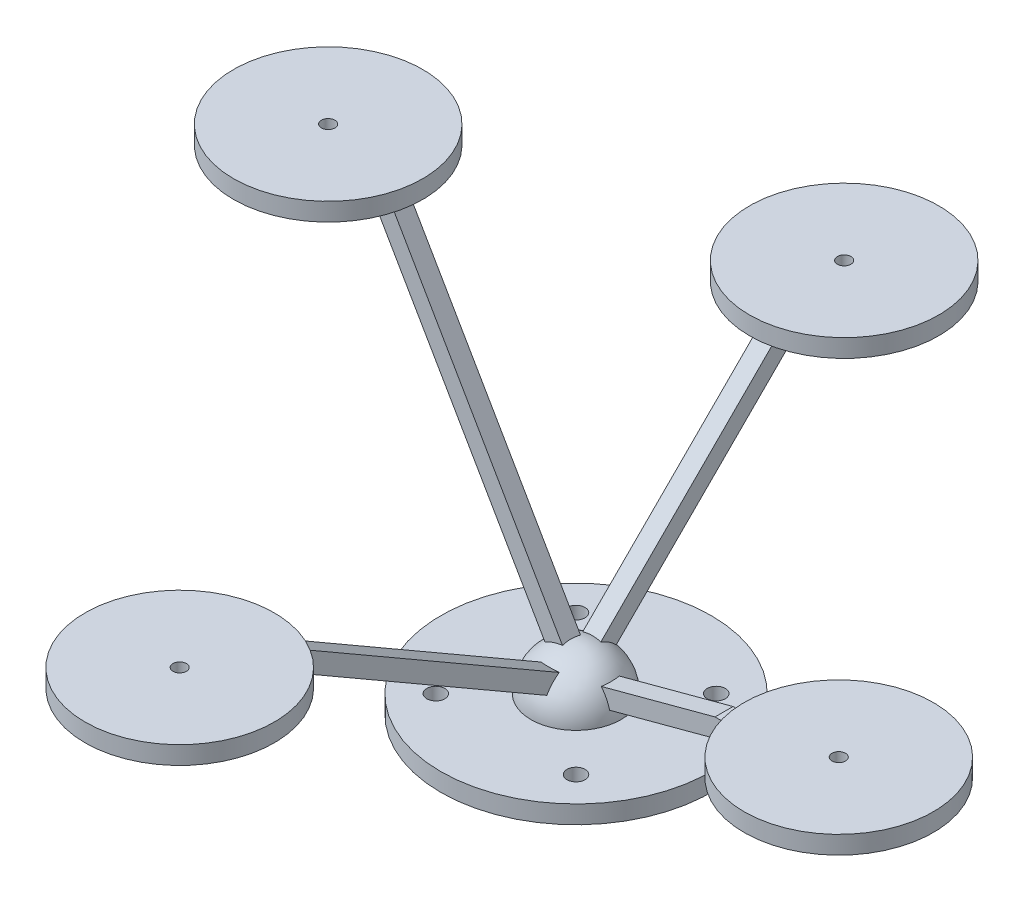
ISO-10303-21;
HEADER;
FILE_DESCRIPTION(('STEP AP214'),'2;1');
FILE_NAME('part.step','',(''),(''),'','','');
FILE_SCHEMA(('AUTOMOTIVE_DESIGN { 1 0 10303 214 1 1 1 1 }'));
ENDSEC;
DATA;
#1=APPLICATION_CONTEXT('core data for automotive mechanical design processes');
#2=APPLICATION_PROTOCOL_DEFINITION('international standard','automotive_design',2000,#1);
#3=PRODUCT_CONTEXT('',#1,'mechanical');
#4=PRODUCT('Part','Part','',(#3));
#5=PRODUCT_RELATED_PRODUCT_CATEGORY('part','',(#4));
#6=PRODUCT_DEFINITION_FORMATION('','',#4);
#7=PRODUCT_DEFINITION_CONTEXT('part definition',#1,'design');
#8=PRODUCT_DEFINITION('design','',#6,#7);
#9=PRODUCT_DEFINITION_SHAPE('','',#8);
#10=(LENGTH_UNIT() NAMED_UNIT(*) SI_UNIT(.MILLI.,.METRE.));
#11=(NAMED_UNIT(*) PLANE_ANGLE_UNIT() SI_UNIT($,.RADIAN.));
#12=(NAMED_UNIT(*) SI_UNIT($,.STERADIAN.) SOLID_ANGLE_UNIT());
#13=UNCERTAINTY_MEASURE_WITH_UNIT(LENGTH_MEASURE(1.E-05),#10,'distance_accuracy_value','');
#14=(GEOMETRIC_REPRESENTATION_CONTEXT(3) GLOBAL_UNCERTAINTY_ASSIGNED_CONTEXT((#13)) GLOBAL_UNIT_ASSIGNED_CONTEXT((#10,
#11,#12)) REPRESENTATION_CONTEXT('',''));
#15=CARTESIAN_POINT('',(0.,0.,0.));
#16=DIRECTION('',(0.,0.,1.));
#17=DIRECTION('',(1.,0.,0.));
#18=AXIS2_PLACEMENT_3D('',#15,#16,#17);
#19=CARTESIAN_POINT('',(0.,2.,0.));
#20=DIRECTION('',(0.,-1.,0.));
#21=DIRECTION('',(0.,0.,-1.));
#22=AXIS2_PLACEMENT_3D('',#19,#20,#21);
#23=SPHERICAL_SURFACE('',#22,5.);
#24=CARTESIAN_POINT('',(0.,2.,0.));
#25=DIRECTION('',(0.,1.,0.));
#26=DIRECTION('',(0.,0.,1.));
#27=AXIS2_PLACEMENT_3D('',#24,#25,#26);
#28=CIRCLE('',#27,5.);
#29=CARTESIAN_POINT('',(0.,2.,5.));
#30=VERTEX_POINT('',#29);
#31=EDGE_CURVE('E326',#30,#30,#28,.T.);
#32=ORIENTED_EDGE('',*,*,#31,.T.);
#33=EDGE_LOOP('',(#32));
#34=FACE_BOUND('',#33,.T.);
#35=CARTESIAN_POINT('',(1.73205080756889,3.,0.));
#36=DIRECTION('',(-0.86602540378444,-0.499999999999999,0.));
#37=DIRECTION('',(0.499999999999998,-0.866025403784439,0.));
#38=AXIS2_PLACEMENT_3D('',#35,#36,#37);
#39=CIRCLE('',#38,4.58257569495584);
#40=CARTESIAN_POINT('',(-0.504017169930898,6.87298334620742,-1.));
#41=VERTEX_POINT('',#40);
#42=CARTESIAN_POINT('',(-0.504017169930893,6.87298334620742,1.));
#43=VERTEX_POINT('',#42);
#44=EDGE_CURVE('E337',#41,#43,#39,.F.);
#45=ORIENTED_EDGE('',*,*,#44,.T.);
#46=CARTESIAN_POINT('',(0.,2.,1.));
#47=DIRECTION('',(0.,0.,-1.));
#48=DIRECTION('',(-1.,0.,0.));
#49=AXIS2_PLACEMENT_3D('',#46,#47,#48);
#50=CIRCLE('',#49,4.89897948556636);
#51=CARTESIAN_POINT('',(-2.44948974278317,6.24264068711929,1.));
#52=VERTEX_POINT('',#51);
#53=EDGE_CURVE('E344',#43,#52,#50,.F.);
#54=ORIENTED_EDGE('',*,*,#53,.T.);
#55=CARTESIAN_POINT('',(0.,2.,0.));
#56=DIRECTION('',(0.86602540378444,0.499999999999998,0.));
#57=DIRECTION('',(-0.499999999999998,0.86602540378444,0.));
#58=AXIS2_PLACEMENT_3D('',#55,#56,#57);
#59=CIRCLE('',#58,5.);
#60=CARTESIAN_POINT('',(-2.44948974278317,6.24264068711929,-1.));
#61=VERTEX_POINT('',#60);
#62=EDGE_CURVE('E341',#52,#61,#59,.F.);
#63=ORIENTED_EDGE('',*,*,#62,.T.);
#64=CARTESIAN_POINT('',(0.,2.,-1.));
#65=DIRECTION('',(0.,0.,-1.));
#66=DIRECTION('',(-1.,0.,0.));
#67=AXIS2_PLACEMENT_3D('',#64,#65,#66);
#68=CIRCLE('',#67,4.89897948556636);
#69=EDGE_CURVE('E333',#41,#61,#68,.F.);
#70=ORIENTED_EDGE('',*,*,#69,.F.);
#71=EDGE_LOOP('',(#45,#54,#63,#70));
#72=FACE_BOUND('',#71,.T.);
#73=CARTESIAN_POINT('',(0.,2.,0.));
#74=DIRECTION('',(-0.258819045102514,0.96592582628907,0.));
#75=DIRECTION('',(-0.96592582628907,-0.258819045102514,0.));
#76=AXIS2_PLACEMENT_3D('',#73,#74,#75);
#77=CIRCLE('',#76,5.);
#78=CARTESIAN_POINT('',(4.73205080756889,3.26794919243109,-1.));
#79=VERTEX_POINT('',#78);
#80=CARTESIAN_POINT('',(4.73205080756889,3.26794919243109,1.));
#81=VERTEX_POINT('',#80);
#82=EDGE_CURVE('E351',#79,#81,#77,.F.);
#83=ORIENTED_EDGE('',*,*,#82,.T.);
#84=CARTESIAN_POINT('',(3.802113527405,5.08932561001975,1.));
#85=VERTEX_POINT('',#84);
#86=EDGE_CURVE('E347',#81,#85,#50,.F.);
#87=ORIENTED_EDGE('',*,*,#86,.T.);
#88=CARTESIAN_POINT('',(-0.517638090205028,3.93185165257814,0.));
#89=DIRECTION('',(0.258819045102515,-0.96592582628907,0.));
#90=DIRECTION('',(0.96592582628907,0.258819045102515,0.));
#91=AXIS2_PLACEMENT_3D('',#88,#89,#90);
#92=CIRCLE('',#91,4.58257569495584);
#93=CARTESIAN_POINT('',(3.802113527405,5.08932561001975,-1.));
#94=VERTEX_POINT('',#93);
#95=EDGE_CURVE('E348',#85,#94,#92,.F.);
#96=ORIENTED_EDGE('',*,*,#95,.T.);
#97=EDGE_CURVE('E338',#79,#94,#68,.F.);
#98=ORIENTED_EDGE('',*,*,#97,.F.);
#99=EDGE_LOOP('',(#83,#87,#96,#98));
#100=FACE_BOUND('',#99,.T.);
#101=CARTESIAN_POINT('',(0.,3.73205080756887,-1.));
#102=DIRECTION('',(0.,-0.866025403784438,0.500000000000001));
#103=DIRECTION('',(0.,-0.500000000000001,-0.866025403784438));
#104=AXIS2_PLACEMENT_3D('',#101,#102,#103);
#105=CIRCLE('',#104,4.58257569495584);
#106=CARTESIAN_POINT('',(-1.,5.96811878506867,2.87298334620742));
#107=VERTEX_POINT('',#106);
#108=CARTESIAN_POINT('',(1.,5.96811878506867,2.87298334620742));
#109=VERTEX_POINT('',#108);
#110=EDGE_CURVE('E177',#107,#109,#105,.F.);
#111=ORIENTED_EDGE('',*,*,#110,.T.);
#112=CARTESIAN_POINT('',(1.,2.,0.));
#113=DIRECTION('',(-1.,0.,0.));
#114=DIRECTION('',(0.,0.,1.));
#115=AXIS2_PLACEMENT_3D('',#112,#113,#114);
#116=CIRCLE('',#115,4.89897948556636);
#117=CARTESIAN_POINT('',(1.,4.44948974278318,4.24264068711928));
#118=VERTEX_POINT('',#117);
#119=EDGE_CURVE('E50',#109,#118,#116,.F.);
#120=ORIENTED_EDGE('',*,*,#119,.T.);
#121=CARTESIAN_POINT('',(0.,2.,0.));
#122=DIRECTION('',(0.,0.866025403784438,-0.500000000000001));
#123=DIRECTION('',(0.,0.500000000000001,0.866025403784438));
#124=AXIS2_PLACEMENT_3D('',#121,#122,#123);
#125=CIRCLE('',#124,5.);
#126=CARTESIAN_POINT('',(-1.,4.44948974278318,4.24264068711928));
#127=VERTEX_POINT('',#126);
#128=EDGE_CURVE('E360',#118,#127,#125,.F.);
#129=ORIENTED_EDGE('',*,*,#128,.T.);
#130=CARTESIAN_POINT('',(-1.,2.,0.));
#131=DIRECTION('',(-1.,0.,0.));
#132=DIRECTION('',(0.,0.,1.));
#133=AXIS2_PLACEMENT_3D('',#130,#131,#132);
#134=CIRCLE('',#133,4.89897948556636);
#135=EDGE_CURVE('E354',#107,#127,#134,.F.);
#136=ORIENTED_EDGE('',*,*,#135,.F.);
#137=EDGE_LOOP('',(#111,#120,#129,#136));
#138=FACE_BOUND('',#137,.T.);
#139=CARTESIAN_POINT('',(0.,2.,0.));
#140=DIRECTION('',(0.,0.707106781186551,0.707106781186544));
#141=DIRECTION('',(0.,-0.707106781186544,0.707106781186551));
#142=AXIS2_PLACEMENT_3D('',#139,#140,#141);
#143=CIRCLE('',#142,5.);
#144=CARTESIAN_POINT('',(-1.,5.46410161513774,-3.46410161513777));
#145=VERTEX_POINT('',#144);
#146=CARTESIAN_POINT('',(1.,5.46410161513774,-3.46410161513777));
#147=VERTEX_POINT('',#146);
#148=EDGE_CURVE('E43',#145,#147,#143,.F.);
#149=ORIENTED_EDGE('',*,*,#148,.T.);
#150=CARTESIAN_POINT('',(1.,6.57649122254147,-1.74806409779531));
#151=VERTEX_POINT('',#150);
#152=EDGE_CURVE('E11',#147,#151,#116,.F.);
#153=ORIENTED_EDGE('',*,*,#152,.T.);
#154=CARTESIAN_POINT('',(0.,3.4142135623731,1.41421356237309));
#155=DIRECTION('',(0.,-0.707106781186551,-0.707106781186544));
#156=DIRECTION('',(0.,0.707106781186544,-0.707106781186551));
#157=AXIS2_PLACEMENT_3D('',#154,#155,#156);
#158=CIRCLE('',#157,4.58257569495584);
#159=CARTESIAN_POINT('',(-1.,6.57649122254147,-1.74806409779531));
#160=VERTEX_POINT('',#159);
#161=EDGE_CURVE('E363',#151,#160,#158,.F.);
#162=ORIENTED_EDGE('',*,*,#161,.T.);
#163=EDGE_CURVE('E357',#145,#160,#134,.F.);
#164=ORIENTED_EDGE('',*,*,#163,.F.);
#165=EDGE_LOOP('',(#149,#153,#162,#164));
#166=FACE_BOUND('',#165,.T.);
#167=ADVANCED_FACE('F39',(#34,#72,#100,#138,#166),#23,.T.);
#168=CARTESIAN_POINT('',(0.,2.,0.));
#169=DIRECTION('',(0.,1.,0.));
#170=DIRECTION('',(0.,0.,1.));
#171=AXIS2_PLACEMENT_3D('',#168,#169,#170);
#172=PLANE('',#171);
#173=ORIENTED_EDGE('',*,*,#31,.F.);
#174=EDGE_LOOP('',(#173));
#175=FACE_BOUND('',#174,.T.);
#176=CARTESIAN_POINT('',(-7.77817459305207,2.,7.77817459305198));
#177=DIRECTION('',(0.,1.,0.));
#178=DIRECTION('',(0.,0.,1.));
#179=AXIS2_PLACEMENT_3D('',#176,#177,#178);
#180=CIRCLE('',#179,1.);
#181=CARTESIAN_POINT('',(-7.77817459305207,2.,8.77817459305198));
#182=VERTEX_POINT('',#181);
#183=EDGE_CURVE('E298',#182,#182,#180,.T.);
#184=ORIENTED_EDGE('',*,*,#183,.F.);
#185=EDGE_LOOP('',(#184));
#186=FACE_BOUND('',#185,.T.);
#187=CARTESIAN_POINT('',(7.77817459305206,2.,-7.77817459305199));
#188=DIRECTION('',(0.,1.,0.));
#189=DIRECTION('',(0.,0.,1.));
#190=AXIS2_PLACEMENT_3D('',#187,#188,#189);
#191=CIRCLE('',#190,1.);
#192=CARTESIAN_POINT('',(7.77817459305206,2.,-6.77817459305198));
#193=VERTEX_POINT('',#192);
#194=EDGE_CURVE('E314',#193,#193,#191,.T.);
#195=ORIENTED_EDGE('',*,*,#194,.F.);
#196=EDGE_LOOP('',(#195));
#197=FACE_BOUND('',#196,.T.);
#198=CARTESIAN_POINT('',(0.,2.,0.));
#199=DIRECTION('',(0.,1.,0.));
#200=DIRECTION('',(0.,0.,1.));
#201=AXIS2_PLACEMENT_3D('',#198,#199,#200);
#202=CIRCLE('',#201,15.);
#203=CARTESIAN_POINT('',(0.,2.,15.));
#204=VERTEX_POINT('',#203);
#205=EDGE_CURVE('E322',#204,#204,#202,.T.);
#206=ORIENTED_EDGE('',*,*,#205,.T.);
#207=EDGE_LOOP('',(#206));
#208=FACE_BOUND('',#207,.T.);
#209=CARTESIAN_POINT('',(-7.77817459305204,2.,-7.77817459305201));
#210=DIRECTION('',(0.,1.,0.));
#211=DIRECTION('',(0.,0.,1.));
#212=AXIS2_PLACEMENT_3D('',#209,#210,#211);
#213=CIRCLE('',#212,0.999999999999995);
#214=CARTESIAN_POINT('',(-7.77817459305204,2.,-6.77817459305201));
#215=VERTEX_POINT('',#214);
#216=EDGE_CURVE('E306',#215,#215,#213,.T.);
#217=ORIENTED_EDGE('',*,*,#216,.F.);
#218=EDGE_LOOP('',(#217));
#219=FACE_BOUND('',#218,.T.);
#220=CARTESIAN_POINT('',(7.77817459305204,2.,7.77817459305201));
#221=DIRECTION('',(0.,1.,0.));
#222=DIRECTION('',(0.,0.,1.));
#223=AXIS2_PLACEMENT_3D('',#220,#221,#222);
#224=CIRCLE('',#223,1.);
#225=CARTESIAN_POINT('',(7.77817459305204,2.,8.77817459305201));
#226=VERTEX_POINT('',#225);
#227=EDGE_CURVE('E290',#226,#226,#224,.T.);
#228=ORIENTED_EDGE('',*,*,#227,.F.);
#229=EDGE_LOOP('',(#228));
#230=FACE_BOUND('',#229,.T.);
#231=ADVANCED_FACE('F460',(#175,#186,#197,#208,#219,#230),#172,.T.);
#232=CARTESIAN_POINT('',(0.,0.,0.));
#233=DIRECTION('',(0.,1.,0.));
#234=DIRECTION('',(0.,0.,1.));
#235=AXIS2_PLACEMENT_3D('',#232,#233,#234);
#236=PLANE('',#235);
#237=CARTESIAN_POINT('',(0.,0.,0.));
#238=DIRECTION('',(0.,1.,0.));
#239=DIRECTION('',(0.,0.,1.));
#240=AXIS2_PLACEMENT_3D('',#237,#238,#239);
#241=CIRCLE('',#240,15.);
#242=CARTESIAN_POINT('',(0.,0.,15.));
#243=VERTEX_POINT('',#242);
#244=EDGE_CURVE('E318',#243,#243,#241,.T.);
#245=ORIENTED_EDGE('',*,*,#244,.F.);
#246=EDGE_LOOP('',(#245));
#247=FACE_BOUND('',#246,.T.);
#248=CARTESIAN_POINT('',(7.77817459305206,0.,-7.77817459305199));
#249=DIRECTION('',(0.,1.,0.));
#250=DIRECTION('',(0.,0.,1.));
#251=AXIS2_PLACEMENT_3D('',#248,#249,#250);
#252=CIRCLE('',#251,1.);
#253=CARTESIAN_POINT('',(7.77817459305206,0.,-6.77817459305198));
#254=VERTEX_POINT('',#253);
#255=EDGE_CURVE('E310',#254,#254,#252,.T.);
#256=ORIENTED_EDGE('',*,*,#255,.T.);
#257=EDGE_LOOP('',(#256));
#258=FACE_BOUND('',#257,.T.);
#259=CARTESIAN_POINT('',(-7.77817459305204,0.,-7.77817459305201));
#260=DIRECTION('',(0.,1.,0.));
#261=DIRECTION('',(0.,0.,1.));
#262=AXIS2_PLACEMENT_3D('',#259,#260,#261);
#263=CIRCLE('',#262,0.999999999999995);
#264=CARTESIAN_POINT('',(-7.77817459305204,0.,-6.77817459305201));
#265=VERTEX_POINT('',#264);
#266=EDGE_CURVE('E302',#265,#265,#263,.T.);
#267=ORIENTED_EDGE('',*,*,#266,.T.);
#268=EDGE_LOOP('',(#267));
#269=FACE_BOUND('',#268,.T.);
#270=CARTESIAN_POINT('',(-7.77817459305207,0.,7.77817459305198));
#271=DIRECTION('',(0.,1.,0.));
#272=DIRECTION('',(0.,0.,1.));
#273=AXIS2_PLACEMENT_3D('',#270,#271,#272);
#274=CIRCLE('',#273,1.);
#275=CARTESIAN_POINT('',(-7.77817459305207,0.,8.77817459305198));
#276=VERTEX_POINT('',#275);
#277=EDGE_CURVE('E294',#276,#276,#274,.T.);
#278=ORIENTED_EDGE('',*,*,#277,.T.);
#279=EDGE_LOOP('',(#278));
#280=FACE_BOUND('',#279,.T.);
#281=CARTESIAN_POINT('',(7.77817459305204,0.,7.77817459305201));
#282=DIRECTION('',(0.,1.,0.));
#283=DIRECTION('',(0.,0.,1.));
#284=AXIS2_PLACEMENT_3D('',#281,#282,#283);
#285=CIRCLE('',#284,1.);
#286=CARTESIAN_POINT('',(7.77817459305204,0.,8.77817459305201));
#287=VERTEX_POINT('',#286);
#288=EDGE_CURVE('E289',#287,#287,#285,.T.);
#289=ORIENTED_EDGE('',*,*,#288,.T.);
#290=EDGE_LOOP('',(#289));
#291=FACE_BOUND('',#290,.T.);
#292=ADVANCED_FACE('F468',(#247,#258,#269,#280,#291),#236,.F.);
#293=CARTESIAN_POINT('',(0.,2.,0.));
#294=DIRECTION('',(0.,-1.,0.));
#295=DIRECTION('',(0.,0.,-1.));
#296=AXIS2_PLACEMENT_3D('',#293,#294,#295);
#297=CYLINDRICAL_SURFACE('',#296,15.);
#298=ORIENTED_EDGE('',*,*,#205,.F.);
#299=EDGE_LOOP('',(#298));
#300=FACE_BOUND('',#299,.T.);
#301=ORIENTED_EDGE('',*,*,#244,.T.);
#302=EDGE_LOOP('',(#301));
#303=FACE_BOUND('',#302,.T.);
#304=ADVANCED_FACE('F41',(#300,#303),#297,.T.);
#305=CARTESIAN_POINT('',(7.77817459305206,2.,-7.77817459305199));
#306=DIRECTION('',(0.,-1.,0.));
#307=DIRECTION('',(0.,0.,-1.));
#308=AXIS2_PLACEMENT_3D('',#305,#306,#307);
#309=CYLINDRICAL_SURFACE('',#308,1.);
#310=ORIENTED_EDGE('',*,*,#194,.T.);
#311=EDGE_LOOP('',(#310));
#312=FACE_BOUND('',#311,.T.);
#313=ORIENTED_EDGE('',*,*,#255,.F.);
#314=EDGE_LOOP('',(#313));
#315=FACE_BOUND('',#314,.T.);
#316=ADVANCED_FACE('F488',(#312,#315),#309,.F.);
#317=CARTESIAN_POINT('',(-7.77817459305204,2.,-7.77817459305201));
#318=DIRECTION('',(0.,-1.,0.));
#319=DIRECTION('',(0.,0.,-1.));
#320=AXIS2_PLACEMENT_3D('',#317,#318,#319);
#321=CYLINDRICAL_SURFACE('',#320,0.999999999999995);
#322=ORIENTED_EDGE('',*,*,#216,.T.);
#323=EDGE_LOOP('',(#322));
#324=FACE_BOUND('',#323,.T.);
#325=ORIENTED_EDGE('',*,*,#266,.F.);
#326=EDGE_LOOP('',(#325));
#327=FACE_BOUND('',#326,.T.);
#328=ADVANCED_FACE('F484',(#324,#327),#321,.F.);
#329=CARTESIAN_POINT('',(-7.77817459305207,2.,7.77817459305198));
#330=DIRECTION('',(0.,-1.,0.));
#331=DIRECTION('',(0.,0.,-1.));
#332=AXIS2_PLACEMENT_3D('',#329,#330,#331);
#333=CYLINDRICAL_SURFACE('',#332,1.);
#334=ORIENTED_EDGE('',*,*,#183,.T.);
#335=EDGE_LOOP('',(#334));
#336=FACE_BOUND('',#335,.T.);
#337=ORIENTED_EDGE('',*,*,#277,.F.);
#338=EDGE_LOOP('',(#337));
#339=FACE_BOUND('',#338,.T.);
#340=ADVANCED_FACE('F480',(#336,#339),#333,.F.);
#341=CARTESIAN_POINT('',(7.77817459305204,2.,7.77817459305201));
#342=DIRECTION('',(0.,-1.,0.));
#343=DIRECTION('',(0.,0.,-1.));
#344=AXIS2_PLACEMENT_3D('',#341,#342,#343);
#345=CYLINDRICAL_SURFACE('',#344,1.);
#346=ORIENTED_EDGE('',*,*,#227,.T.);
#347=EDGE_LOOP('',(#346));
#348=FACE_BOUND('',#347,.T.);
#349=ORIENTED_EDGE('',*,*,#288,.F.);
#350=EDGE_LOOP('',(#349));
#351=FACE_BOUND('',#350,.T.);
#352=ADVANCED_FACE('F476',(#348,#351),#345,.F.);
#353=CARTESIAN_POINT('',(0.,0.,1.));
#354=DIRECTION('',(0.,0.,-1.));
#355=DIRECTION('',(-1.,0.,0.));
#356=AXIS2_PLACEMENT_3D('',#353,#354,#355);
#357=PLANE('',#356);
#358=ORIENTED_EDGE('',*,*,#53,.F.);
#359=DIRECTION('',(-0.499999999999998,0.866025403784439,0.));
#360=VECTOR('',#359,1.);
#361=CARTESIAN_POINT('',(-20.1905989232414,40.9711431702998,1.));
#362=LINE('',#361,#360);
#363=CARTESIAN_POINT('',(-20.1905989232414,40.9711431702998,1.));
#364=VERTEX_POINT('',#363);
#365=EDGE_CURVE('E246',#43,#364,#362,.T.);
#366=ORIENTED_EDGE('',*,*,#365,.T.);
#367=DIRECTION('',(-1.,0.,0.));
#368=VECTOR('',#367,1.);
#369=CARTESIAN_POINT('',(-22.4999999999999,40.9711431702998,1.));
#370=LINE('',#369,#368);
#371=CARTESIAN_POINT('',(-22.4999999999999,40.9711431702998,1.));
#372=VERTEX_POINT('',#371);
#373=EDGE_CURVE('E249',#364,#372,#370,.T.);
#374=ORIENTED_EDGE('',*,*,#373,.T.);
#375=DIRECTION('',(0.499999999999998,-0.86602540378444,0.));
#376=VECTOR('',#375,1.);
#377=CARTESIAN_POINT('',(0.,2.,1.));
#378=LINE('',#377,#376);
#379=EDGE_CURVE('E230',#372,#52,#378,.T.);
#380=ORIENTED_EDGE('',*,*,#379,.T.);
#381=EDGE_LOOP('',(#358,#366,#374,#380));
#382=FACE_BOUND('',#381,.T.);
#383=ADVANCED_FACE('F479',(#382),#357,.F.);
#384=CARTESIAN_POINT('',(0.,0.,-1.));
#385=DIRECTION('',(0.,0.,-1.));
#386=DIRECTION('',(-1.,0.,0.));
#387=AXIS2_PLACEMENT_3D('',#384,#385,#386);
#388=PLANE('',#387);
#389=DIRECTION('',(-0.499999999999998,0.866025403784439,0.));
#390=VECTOR('',#389,1.);
#391=CARTESIAN_POINT('',(-20.1905989232414,40.9711431702998,-1.));
#392=LINE('',#391,#390);
#393=CARTESIAN_POINT('',(-20.1905989232414,40.9711431702998,-1.));
#394=VERTEX_POINT('',#393);
#395=EDGE_CURVE('E268',#41,#394,#392,.T.);
#396=ORIENTED_EDGE('',*,*,#395,.F.);
#397=ORIENTED_EDGE('',*,*,#69,.T.);
#398=DIRECTION('',(0.499999999999998,-0.86602540378444,0.));
#399=VECTOR('',#398,1.);
#400=CARTESIAN_POINT('',(0.,2.,-1.));
#401=LINE('',#400,#399);
#402=CARTESIAN_POINT('',(-22.4999999999999,40.9711431702998,-1.));
#403=VERTEX_POINT('',#402);
#404=EDGE_CURVE('E225',#403,#61,#401,.T.);
#405=ORIENTED_EDGE('',*,*,#404,.F.);
#406=DIRECTION('',(-1.,0.,0.));
#407=VECTOR('',#406,1.);
#408=CARTESIAN_POINT('',(-22.4999999999999,40.9711431702998,-1.));
#409=LINE('',#408,#407);
#410=EDGE_CURVE('E235',#394,#403,#409,.T.);
#411=ORIENTED_EDGE('',*,*,#410,.F.);
#412=EDGE_LOOP('',(#396,#397,#405,#411));
#413=FACE_BOUND('',#412,.T.);
#414=ADVANCED_FACE('F549',(#413),#388,.T.);
#415=CARTESIAN_POINT('',(-20.1905989232414,40.9711431702998,1.));
#416=DIRECTION('',(-0.86602540378444,-0.499999999999999,0.));
#417=DIRECTION('',(0.499999999999998,-0.866025403784439,0.));
#418=AXIS2_PLACEMENT_3D('',#415,#416,#417);
#419=PLANE('',#418);
#420=ORIENTED_EDGE('',*,*,#44,.F.);
#421=ORIENTED_EDGE('',*,*,#395,.T.);
#422=DIRECTION('',(0.,0.,-1.));
#423=VECTOR('',#422,1.);
#424=CARTESIAN_POINT('',(-20.1905989232414,40.9711431702998,1.));
#425=LINE('',#424,#423);
#426=EDGE_CURVE('E277',#364,#394,#425,.T.);
#427=ORIENTED_EDGE('',*,*,#426,.F.);
#428=ORIENTED_EDGE('',*,*,#365,.F.);
#429=EDGE_LOOP('',(#420,#421,#427,#428));
#430=FACE_BOUND('',#429,.T.);
#431=ADVANCED_FACE('F559',(#430),#419,.F.);
#432=CARTESIAN_POINT('',(0.,2.,1.));
#433=DIRECTION('',(0.86602540378444,0.499999999999998,0.));
#434=DIRECTION('',(-0.499999999999998,0.86602540378444,0.));
#435=AXIS2_PLACEMENT_3D('',#432,#433,#434);
#436=PLANE('',#435);
#437=ORIENTED_EDGE('',*,*,#62,.F.);
#438=ORIENTED_EDGE('',*,*,#379,.F.);
#439=DIRECTION('',(0.,0.,-1.));
#440=VECTOR('',#439,1.);
#441=CARTESIAN_POINT('',(-22.4999999999999,40.9711431702998,1.));
#442=LINE('',#441,#440);
#443=EDGE_CURVE('E252',#372,#403,#442,.T.);
#444=ORIENTED_EDGE('',*,*,#443,.T.);
#445=ORIENTED_EDGE('',*,*,#404,.T.);
#446=EDGE_LOOP('',(#437,#438,#444,#445));
#447=FACE_BOUND('',#446,.T.);
#448=ADVANCED_FACE('F474',(#447),#436,.F.);
#449=ORIENTED_EDGE('',*,*,#86,.F.);
#450=DIRECTION('',(0.96592582628907,0.258819045102514,0.));
#451=VECTOR('',#450,1.);
#452=CARTESIAN_POINT('',(0.,2.,1.));
#453=LINE('',#452,#451);
#454=CARTESIAN_POINT('',(24.1481456572267,8.47047612756286,1.));
#455=VERTEX_POINT('',#454);
#456=EDGE_CURVE('E234',#81,#455,#453,.T.);
#457=ORIENTED_EDGE('',*,*,#456,.T.);
#458=DIRECTION('',(-1.,0.,0.));
#459=VECTOR('',#458,1.);
#460=CARTESIAN_POINT('',(16.420739046914,8.47047612756286,1.));
#461=LINE('',#460,#459);
#462=CARTESIAN_POINT('',(18.6958731770433,8.47047612756286,1.));
#463=VERTEX_POINT('',#462);
#464=EDGE_CURVE('E239',#455,#463,#461,.T.);
#465=ORIENTED_EDGE('',*,*,#464,.T.);
#466=CARTESIAN_POINT('',(16.420739046914,8.47047612756286,1.));
#467=VERTEX_POINT('',#466);
#468=EDGE_CURVE('E238',#463,#467,#461,.T.);
#469=ORIENTED_EDGE('',*,*,#468,.T.);
#470=DIRECTION('',(-0.96592582628907,-0.258819045102515,0.));
#471=VECTOR('',#470,1.);
#472=CARTESIAN_POINT('',(0.,4.07055236082016,1.));
#473=LINE('',#472,#471);
#474=EDGE_CURVE('E242',#467,#85,#473,.T.);
#475=ORIENTED_EDGE('',*,*,#474,.T.);
#476=EDGE_LOOP('',(#449,#457,#465,#469,#475));
#477=FACE_BOUND('',#476,.T.);
#478=ADVANCED_FACE('F552',(#477),#357,.F.);
#479=DIRECTION('',(0.96592582628907,0.258819045102514,0.));
#480=VECTOR('',#479,1.);
#481=CARTESIAN_POINT('',(0.,2.,-1.));
#482=LINE('',#481,#480);
#483=CARTESIAN_POINT('',(24.1481456572267,8.47047612756286,-1.));
#484=VERTEX_POINT('',#483);
#485=EDGE_CURVE('E256',#79,#484,#482,.T.);
#486=ORIENTED_EDGE('',*,*,#485,.F.);
#487=ORIENTED_EDGE('',*,*,#97,.T.);
#488=DIRECTION('',(-0.96592582628907,-0.258819045102515,0.));
#489=VECTOR('',#488,1.);
#490=CARTESIAN_POINT('',(0.,4.07055236082016,-1.));
#491=LINE('',#490,#489);
#492=CARTESIAN_POINT('',(16.420739046914,8.47047612756286,-1.));
#493=VERTEX_POINT('',#492);
#494=EDGE_CURVE('E264',#493,#94,#491,.T.);
#495=ORIENTED_EDGE('',*,*,#494,.F.);
#496=DIRECTION('',(-1.,0.,0.));
#497=VECTOR('',#496,1.);
#498=CARTESIAN_POINT('',(16.420739046914,8.47047612756286,-1.));
#499=LINE('',#498,#497);
#500=CARTESIAN_POINT('',(18.6958731770433,8.47047612756285,-1.));
#501=VERTEX_POINT('',#500);
#502=EDGE_CURVE('E259',#501,#493,#499,.T.);
#503=ORIENTED_EDGE('',*,*,#502,.F.);
#504=EDGE_CURVE('E260',#484,#501,#499,.T.);
#505=ORIENTED_EDGE('',*,*,#504,.F.);
#506=EDGE_LOOP('',(#486,#487,#495,#503,#505));
#507=FACE_BOUND('',#506,.T.);
#508=ADVANCED_FACE('F562',(#507),#388,.T.);
#509=CARTESIAN_POINT('',(0.,2.,1.));
#510=DIRECTION('',(-0.258819045102514,0.96592582628907,0.));
#511=DIRECTION('',(-0.96592582628907,-0.258819045102514,0.));
#512=AXIS2_PLACEMENT_3D('',#509,#510,#511);
#513=PLANE('',#512);
#514=ORIENTED_EDGE('',*,*,#82,.F.);
#515=ORIENTED_EDGE('',*,*,#485,.T.);
#516=DIRECTION('',(0.,0.,-1.));
#517=VECTOR('',#516,1.);
#518=CARTESIAN_POINT('',(24.1481456572267,8.47047612756286,1.));
#519=LINE('',#518,#517);
#520=EDGE_CURVE('E285',#455,#484,#519,.T.);
#521=ORIENTED_EDGE('',*,*,#520,.F.);
#522=ORIENTED_EDGE('',*,*,#456,.F.);
#523=EDGE_LOOP('',(#514,#515,#521,#522));
#524=FACE_BOUND('',#523,.T.);
#525=ADVANCED_FACE('F589',(#524),#513,.F.);
#526=CARTESIAN_POINT('',(16.420739046914,8.47047612756286,1.));
#527=DIRECTION('',(0.,-1.,0.));
#528=DIRECTION('',(1.,0.,0.));
#529=AXIS2_PLACEMENT_3D('',#526,#527,#528);
#530=PLANE('',#529);
#531=CARTESIAN_POINT('',(29.1481456572267,8.47047612756286,0.));
#532=DIRECTION('',(0.,1.,0.));
#533=DIRECTION('',(0.,0.,1.));
#534=AXIS2_PLACEMENT_3D('',#531,#532,#533);
#535=CIRCLE('',#534,10.5);
#536=EDGE_CURVE('E226',#501,#463,#535,.T.);
#537=ORIENTED_EDGE('',*,*,#536,.F.);
#538=ORIENTED_EDGE('',*,*,#502,.T.);
#539=DIRECTION('',(0.,0.,-1.));
#540=VECTOR('',#539,1.);
#541=CARTESIAN_POINT('',(16.420739046914,8.47047612756286,1.));
#542=LINE('',#541,#540);
#543=EDGE_CURVE('E281',#467,#493,#542,.T.);
#544=ORIENTED_EDGE('',*,*,#543,.F.);
#545=ORIENTED_EDGE('',*,*,#468,.F.);
#546=EDGE_LOOP('',(#537,#538,#544,#545));
#547=FACE_BOUND('',#546,.T.);
#548=ADVANCED_FACE('F596',(#547),#530,.F.);
#549=CARTESIAN_POINT('',(0.,4.07055236082016,1.));
#550=DIRECTION('',(0.258819045102515,-0.96592582628907,0.));
#551=DIRECTION('',(0.96592582628907,0.258819045102515,0.));
#552=AXIS2_PLACEMENT_3D('',#549,#550,#551);
#553=PLANE('',#552);
#554=ORIENTED_EDGE('',*,*,#95,.F.);
#555=ORIENTED_EDGE('',*,*,#474,.F.);
#556=ORIENTED_EDGE('',*,*,#543,.T.);
#557=ORIENTED_EDGE('',*,*,#494,.T.);
#558=EDGE_LOOP('',(#554,#555,#556,#557));
#559=FACE_BOUND('',#558,.T.);
#560=ADVANCED_FACE('F603',(#559),#553,.F.);
#561=CARTESIAN_POINT('',(29.1481456572267,8.47047612756286,0.));
#562=DIRECTION('',(0.,1.,0.));
#563=DIRECTION('',(0.,0.,1.));
#564=AXIS2_PLACEMENT_3D('',#561,#562,#563);
#565=PLANE('',#564);
#566=CARTESIAN_POINT('',(29.1481456572267,8.47047612756286,0.));
#567=DIRECTION('',(0.,1.,0.));
#568=DIRECTION('',(0.,0.,1.));
#569=AXIS2_PLACEMENT_3D('',#566,#567,#568);
#570=CIRCLE('',#569,0.750000000000002);
#571=CARTESIAN_POINT('',(29.1481456572267,8.47047612756286,0.750000000000002));
#572=VERTEX_POINT('',#571);
#573=EDGE_CURVE('E209',#572,#572,#570,.T.);
#574=ORIENTED_EDGE('',*,*,#573,.T.);
#575=EDGE_LOOP('',(#574));
#576=FACE_BOUND('',#575,.T.);
#577=ORIENTED_EDGE('',*,*,#520,.T.);
#578=ORIENTED_EDGE('',*,*,#504,.T.);
#579=EDGE_CURVE('E217',#463,#501,#535,.T.);
#580=ORIENTED_EDGE('',*,*,#579,.F.);
#581=ORIENTED_EDGE('',*,*,#464,.F.);
#582=EDGE_LOOP('',(#577,#578,#580,#581));
#583=FACE_BOUND('',#582,.T.);
#584=ADVANCED_FACE('F611',(#576,#583),#565,.F.);
#585=CARTESIAN_POINT('',(29.1481456572267,10.4704761275629,0.));
#586=DIRECTION('',(0.,1.,0.));
#587=DIRECTION('',(0.,0.,1.));
#588=AXIS2_PLACEMENT_3D('',#585,#586,#587);
#589=PLANE('',#588);
#590=CARTESIAN_POINT('',(29.1481456572267,10.4704761275629,0.));
#591=DIRECTION('',(0.,1.,0.));
#592=DIRECTION('',(0.,0.,1.));
#593=AXIS2_PLACEMENT_3D('',#590,#591,#592);
#594=CIRCLE('',#593,10.5);
#595=CARTESIAN_POINT('',(29.1481456572267,10.4704761275629,10.5));
#596=VERTEX_POINT('',#595);
#597=EDGE_CURVE('E221',#596,#596,#594,.T.);
#598=ORIENTED_EDGE('',*,*,#597,.T.);
#599=EDGE_LOOP('',(#598));
#600=FACE_BOUND('',#599,.T.);
#601=CARTESIAN_POINT('',(29.1481456572267,10.4704761275629,0.));
#602=DIRECTION('',(0.,1.,0.));
#603=DIRECTION('',(0.,0.,1.));
#604=AXIS2_PLACEMENT_3D('',#601,#602,#603);
#605=CIRCLE('',#604,0.750000000000002);
#606=CARTESIAN_POINT('',(29.1481456572267,10.4704761275629,0.750000000000002));
#607=VERTEX_POINT('',#606);
#608=EDGE_CURVE('E213',#607,#607,#605,.T.);
#609=ORIENTED_EDGE('',*,*,#608,.F.);
#610=EDGE_LOOP('',(#609));
#611=FACE_BOUND('',#610,.T.);
#612=ADVANCED_FACE('F618',(#600,#611),#589,.T.);
#613=CARTESIAN_POINT('',(29.1481456572267,10.4704761275629,0.));
#614=DIRECTION('',(0.,-1.,0.));
#615=DIRECTION('',(0.,0.,-1.));
#616=AXIS2_PLACEMENT_3D('',#613,#614,#615);
#617=CYLINDRICAL_SURFACE('',#616,10.5);
#618=ORIENTED_EDGE('',*,*,#597,.F.);
#619=EDGE_LOOP('',(#618));
#620=FACE_BOUND('',#619,.T.);
#621=ORIENTED_EDGE('',*,*,#536,.T.);
#622=ORIENTED_EDGE('',*,*,#579,.T.);
#623=EDGE_LOOP('',(#621,#622));
#624=FACE_BOUND('',#623,.T.);
#625=ADVANCED_FACE('F626',(#620,#624),#617,.T.);
#626=CARTESIAN_POINT('',(29.1481456572267,10.4704761275629,0.));
#627=DIRECTION('',(0.,-1.,0.));
#628=DIRECTION('',(0.,0.,-1.));
#629=AXIS2_PLACEMENT_3D('',#626,#627,#628);
#630=CYLINDRICAL_SURFACE('',#629,0.750000000000002);
#631=ORIENTED_EDGE('',*,*,#608,.T.);
#632=EDGE_LOOP('',(#631));
#633=FACE_BOUND('',#632,.T.);
#634=ORIENTED_EDGE('',*,*,#573,.F.);
#635=EDGE_LOOP('',(#634));
#636=FACE_BOUND('',#635,.T.);
#637=ADVANCED_FACE('F634',(#633,#636),#630,.F.);
#638=CARTESIAN_POINT('',(-27.4999999999999,40.9711431702998,0.));
#639=DIRECTION('',(0.,1.,0.));
#640=DIRECTION('',(0.,0.,1.));
#641=AXIS2_PLACEMENT_3D('',#638,#639,#640);
#642=PLANE('',#641);
#643=CARTESIAN_POINT('',(-27.4999999999999,40.9711431702998,0.));
#644=DIRECTION('',(0.,1.,0.));
#645=DIRECTION('',(0.,0.,1.));
#646=AXIS2_PLACEMENT_3D('',#643,#644,#645);
#647=CIRCLE('',#646,10.5);
#648=CARTESIAN_POINT('',(-27.4999999999999,40.9711431702998,10.5));
#649=VERTEX_POINT('',#648);
#650=EDGE_CURVE('E201',#649,#649,#647,.T.);
#651=ORIENTED_EDGE('',*,*,#650,.F.);
#652=EDGE_LOOP('',(#651));
#653=FACE_BOUND('',#652,.T.);
#654=CARTESIAN_POINT('',(-27.4999999999999,40.9711431702998,0.));
#655=DIRECTION('',(0.,1.,0.));
#656=DIRECTION('',(0.,0.,1.));
#657=AXIS2_PLACEMENT_3D('',#654,#655,#656);
#658=CIRCLE('',#657,0.749999999999998);
#659=CARTESIAN_POINT('',(-27.4999999999999,40.9711431702998,0.749999999999998));
#660=VERTEX_POINT('',#659);
#661=EDGE_CURVE('E196',#660,#660,#658,.T.);
#662=ORIENTED_EDGE('',*,*,#661,.T.);
#663=EDGE_LOOP('',(#662));
#664=FACE_BOUND('',#663,.T.);
#665=ORIENTED_EDGE('',*,*,#426,.T.);
#666=ORIENTED_EDGE('',*,*,#410,.T.);
#667=ORIENTED_EDGE('',*,*,#443,.F.);
#668=ORIENTED_EDGE('',*,*,#373,.F.);
#669=EDGE_LOOP('',(#665,#666,#667,#668));
#670=FACE_BOUND('',#669,.T.);
#671=ADVANCED_FACE('F641',(#653,#664,#670),#642,.F.);
#672=CARTESIAN_POINT('',(-27.4999999999999,42.9711431702998,0.));
#673=DIRECTION('',(0.,1.,0.));
#674=DIRECTION('',(0.,0.,1.));
#675=AXIS2_PLACEMENT_3D('',#672,#673,#674);
#676=PLANE('',#675);
#677=CARTESIAN_POINT('',(-27.4999999999999,42.9711431702998,0.));
#678=DIRECTION('',(0.,1.,0.));
#679=DIRECTION('',(0.,0.,1.));
#680=AXIS2_PLACEMENT_3D('',#677,#678,#679);
#681=CIRCLE('',#680,10.5);
#682=CARTESIAN_POINT('',(-27.4999999999999,42.9711431702998,10.5));
#683=VERTEX_POINT('',#682);
#684=EDGE_CURVE('E205',#683,#683,#681,.T.);
#685=ORIENTED_EDGE('',*,*,#684,.T.);
#686=EDGE_LOOP('',(#685));
#687=FACE_BOUND('',#686,.T.);
#688=CARTESIAN_POINT('',(-27.4999999999999,42.9711431702998,0.));
#689=DIRECTION('',(0.,1.,0.));
#690=DIRECTION('',(0.,0.,1.));
#691=AXIS2_PLACEMENT_3D('',#688,#689,#690);
#692=CIRCLE('',#691,0.749999999999998);
#693=CARTESIAN_POINT('',(-27.4999999999999,42.9711431702998,0.749999999999998));
#694=VERTEX_POINT('',#693);
#695=EDGE_CURVE('E197',#694,#694,#692,.T.);
#696=ORIENTED_EDGE('',*,*,#695,.F.);
#697=EDGE_LOOP('',(#696));
#698=FACE_BOUND('',#697,.T.);
#699=ADVANCED_FACE('F648',(#687,#698),#676,.T.);
#700=CARTESIAN_POINT('',(-27.4999999999999,42.9711431702998,0.));
#701=DIRECTION('',(0.,-1.,0.));
#702=DIRECTION('',(0.,0.,-1.));
#703=AXIS2_PLACEMENT_3D('',#700,#701,#702);
#704=CYLINDRICAL_SURFACE('',#703,10.5);
#705=ORIENTED_EDGE('',*,*,#684,.F.);
#706=EDGE_LOOP('',(#705));
#707=FACE_BOUND('',#706,.T.);
#708=ORIENTED_EDGE('',*,*,#650,.T.);
#709=EDGE_LOOP('',(#708));
#710=FACE_BOUND('',#709,.T.);
#711=ADVANCED_FACE('F656',(#707,#710),#704,.T.);
#712=CARTESIAN_POINT('',(-27.4999999999999,42.9711431702998,0.));
#713=DIRECTION('',(0.,-1.,0.));
#714=DIRECTION('',(0.,0.,-1.));
#715=AXIS2_PLACEMENT_3D('',#712,#713,#714);
#716=CYLINDRICAL_SURFACE('',#715,0.749999999999998);
#717=ORIENTED_EDGE('',*,*,#695,.T.);
#718=EDGE_LOOP('',(#717));
#719=FACE_BOUND('',#718,.T.);
#720=ORIENTED_EDGE('',*,*,#661,.F.);
#721=EDGE_LOOP('',(#720));
#722=FACE_BOUND('',#721,.T.);
#723=ADVANCED_FACE('F664',(#719,#722),#716,.F.);
#724=CARTESIAN_POINT('',(1.,0.,0.));
#725=DIRECTION('',(-1.,0.,0.));
#726=DIRECTION('',(0.,0.,1.));
#727=AXIS2_PLACEMENT_3D('',#724,#725,#726);
#728=PLANE('',#727);
#729=ORIENTED_EDGE('',*,*,#119,.F.);
#730=DIRECTION('',(0.,0.500000000000001,0.866025403784438));
#731=VECTOR('',#730,1.);
#732=CARTESIAN_POINT('',(1.,4.3094010767585,0.));
#733=LINE('',#732,#731);
#734=CARTESIAN_POINT('',(1.,24.5,34.9711431702997));
#735=VERTEX_POINT('',#734);
#736=EDGE_CURVE('E394',#109,#735,#733,.T.);
#737=ORIENTED_EDGE('',*,*,#736,.T.);
#738=DIRECTION('',(0.,0.,1.));
#739=VECTOR('',#738,1.);
#740=CARTESIAN_POINT('',(1.,24.5,38.9711431702997));
#741=LINE('',#740,#739);
#742=CARTESIAN_POINT('',(1.,24.5,38.9711431702997));
#743=VERTEX_POINT('',#742);
#744=EDGE_CURVE('E182',#735,#743,#741,.T.);
#745=ORIENTED_EDGE('',*,*,#744,.T.);
#746=DIRECTION('',(0.,-0.500000000000001,-0.866025403784438));
#747=VECTOR('',#746,1.);
#748=CARTESIAN_POINT('',(1.,2.,0.));
#749=LINE('',#748,#747);
#750=EDGE_CURVE('E168',#743,#118,#749,.T.);
#751=ORIENTED_EDGE('',*,*,#750,.T.);
#752=EDGE_LOOP('',(#729,#737,#745,#751));
#753=FACE_BOUND('',#752,.T.);
#754=ADVANCED_FACE('F671',(#753),#728,.F.);
#755=CARTESIAN_POINT('',(-1.,0.,0.));
#756=DIRECTION('',(-1.,0.,0.));
#757=DIRECTION('',(0.,0.,1.));
#758=AXIS2_PLACEMENT_3D('',#755,#756,#757);
#759=PLANE('',#758);
#760=DIRECTION('',(0.,0.500000000000001,0.866025403784438));
#761=VECTOR('',#760,1.);
#762=CARTESIAN_POINT('',(-1.,4.3094010767585,0.));
#763=LINE('',#762,#761);
#764=CARTESIAN_POINT('',(-1.,24.5,34.9711431702997));
#765=VERTEX_POINT('',#764);
#766=EDGE_CURVE('E161',#107,#765,#763,.T.);
#767=ORIENTED_EDGE('',*,*,#766,.F.);
#768=ORIENTED_EDGE('',*,*,#135,.T.);
#769=DIRECTION('',(0.,-0.500000000000001,-0.866025403784438));
#770=VECTOR('',#769,1.);
#771=CARTESIAN_POINT('',(-1.,2.,0.));
#772=LINE('',#771,#770);
#773=CARTESIAN_POINT('',(-1.,24.5,38.9711431702997));
#774=VERTEX_POINT('',#773);
#775=EDGE_CURVE('E163',#774,#127,#772,.T.);
#776=ORIENTED_EDGE('',*,*,#775,.F.);
#777=DIRECTION('',(0.,0.,1.));
#778=VECTOR('',#777,1.);
#779=CARTESIAN_POINT('',(-1.,24.5,38.9711431702997));
#780=LINE('',#779,#778);
#781=EDGE_CURVE('E157',#765,#774,#780,.T.);
#782=ORIENTED_EDGE('',*,*,#781,.F.);
#783=EDGE_LOOP('',(#767,#768,#776,#782));
#784=FACE_BOUND('',#783,.T.);
#785=ADVANCED_FACE('F159',(#784),#759,.T.);
#786=CARTESIAN_POINT('',(1.,4.3094010767585,0.));
#787=DIRECTION('',(0.,-0.866025403784438,0.500000000000001));
#788=DIRECTION('',(0.,-0.500000000000001,-0.866025403784438));
#789=AXIS2_PLACEMENT_3D('',#786,#787,#788);
#790=PLANE('',#789);
#791=ORIENTED_EDGE('',*,*,#110,.F.);
#792=ORIENTED_EDGE('',*,*,#766,.T.);
#793=DIRECTION('',(-1.,0.,0.));
#794=VECTOR('',#793,1.);
#795=CARTESIAN_POINT('',(1.,24.5,34.9711431702997));
#796=LINE('',#795,#794);
#797=EDGE_CURVE('E175',#735,#765,#796,.T.);
#798=ORIENTED_EDGE('',*,*,#797,.F.);
#799=ORIENTED_EDGE('',*,*,#736,.F.);
#800=EDGE_LOOP('',(#791,#792,#798,#799));
#801=FACE_BOUND('',#800,.T.);
#802=ADVANCED_FACE('F173',(#801),#790,.F.);
#803=CARTESIAN_POINT('',(1.,2.,0.));
#804=DIRECTION('',(0.,0.866025403784438,-0.500000000000001));
#805=DIRECTION('',(0.,0.500000000000001,0.866025403784438));
#806=AXIS2_PLACEMENT_3D('',#803,#804,#805);
#807=PLANE('',#806);
#808=ORIENTED_EDGE('',*,*,#128,.F.);
#809=ORIENTED_EDGE('',*,*,#750,.F.);
#810=DIRECTION('',(-1.,0.,0.));
#811=VECTOR('',#810,1.);
#812=CARTESIAN_POINT('',(1.,24.5,38.9711431702997));
#813=LINE('',#812,#811);
#814=EDGE_CURVE('E185',#743,#774,#813,.T.);
#815=ORIENTED_EDGE('',*,*,#814,.T.);
#816=ORIENTED_EDGE('',*,*,#775,.T.);
#817=EDGE_LOOP('',(#808,#809,#815,#816));
#818=FACE_BOUND('',#817,.T.);
#819=ADVANCED_FACE('F692',(#818),#807,.F.);
#820=ORIENTED_EDGE('',*,*,#152,.F.);
#821=DIRECTION('',(0.,0.707106781186544,-0.707106781186551));
#822=VECTOR('',#821,1.);
#823=CARTESIAN_POINT('',(1.,2.,0.));
#824=LINE('',#823,#822);
#825=CARTESIAN_POINT('',(1.,26.748737341529,-24.7487373415293));
#826=VERTEX_POINT('',#825);
#827=EDGE_CURVE('E403',#147,#826,#824,.T.);
#828=ORIENTED_EDGE('',*,*,#827,.T.);
#829=DIRECTION('',(0.,0.,1.));
#830=VECTOR('',#829,1.);
#831=CARTESIAN_POINT('',(1.,26.748737341529,-21.9203102167831));
#832=LINE('',#831,#830);
#833=CARTESIAN_POINT('',(1.,26.748737341529,-21.9203102167831));
#834=VERTEX_POINT('',#833);
#835=EDGE_CURVE('E400',#826,#834,#832,.T.);
#836=ORIENTED_EDGE('',*,*,#835,.T.);
#837=DIRECTION('',(0.,-0.707106781186544,0.707106781186551));
#838=VECTOR('',#837,1.);
#839=CARTESIAN_POINT('',(1.,4.82842712474617,0.));
#840=LINE('',#839,#838);
#841=EDGE_CURVE('E397',#834,#151,#840,.T.);
#842=ORIENTED_EDGE('',*,*,#841,.T.);
#843=EDGE_LOOP('',(#820,#828,#836,#842));
#844=FACE_BOUND('',#843,.T.);
#845=ADVANCED_FACE('F680',(#844),#728,.F.);
#846=DIRECTION('',(0.,0.707106781186544,-0.707106781186551));
#847=VECTOR('',#846,1.);
#848=CARTESIAN_POINT('',(-1.,2.,0.));
#849=LINE('',#848,#847);
#850=CARTESIAN_POINT('',(-1.,26.748737341529,-24.7487373415293));
#851=VERTEX_POINT('',#850);
#852=EDGE_CURVE('E375',#145,#851,#849,.T.);
#853=ORIENTED_EDGE('',*,*,#852,.F.);
#854=ORIENTED_EDGE('',*,*,#163,.T.);
#855=DIRECTION('',(0.,-0.707106781186544,0.707106781186551));
#856=VECTOR('',#855,1.);
#857=CARTESIAN_POINT('',(-1.,4.82842712474617,0.));
#858=LINE('',#857,#856);
#859=CARTESIAN_POINT('',(-1.,26.748737341529,-21.9203102167831));
#860=VERTEX_POINT('',#859);
#861=EDGE_CURVE('E179',#860,#160,#858,.T.);
#862=ORIENTED_EDGE('',*,*,#861,.F.);
#863=DIRECTION('',(0.,0.,1.));
#864=VECTOR('',#863,1.);
#865=CARTESIAN_POINT('',(-1.,26.748737341529,-21.9203102167831));
#866=LINE('',#865,#864);
#867=EDGE_CURVE('E382',#851,#860,#866,.T.);
#868=ORIENTED_EDGE('',*,*,#867,.F.);
#869=EDGE_LOOP('',(#853,#854,#862,#868));
#870=FACE_BOUND('',#869,.T.);
#871=ADVANCED_FACE('F372',(#870),#759,.T.);
#872=CARTESIAN_POINT('',(1.,2.,0.));
#873=DIRECTION('',(0.,0.707106781186551,0.707106781186544));
#874=DIRECTION('',(0.,-0.707106781186544,0.707106781186551));
#875=AXIS2_PLACEMENT_3D('',#872,#873,#874);
#876=PLANE('',#875);
#877=ORIENTED_EDGE('',*,*,#148,.F.);
#878=ORIENTED_EDGE('',*,*,#852,.T.);
#879=DIRECTION('',(-1.,0.,0.));
#880=VECTOR('',#879,1.);
#881=CARTESIAN_POINT('',(1.,26.748737341529,-24.7487373415293));
#882=LINE('',#881,#880);
#883=EDGE_CURVE('E189',#826,#851,#882,.T.);
#884=ORIENTED_EDGE('',*,*,#883,.F.);
#885=ORIENTED_EDGE('',*,*,#827,.F.);
#886=EDGE_LOOP('',(#877,#878,#884,#885));
#887=FACE_BOUND('',#886,.T.);
#888=ADVANCED_FACE('F712',(#887),#876,.F.);
#889=CARTESIAN_POINT('',(1.,4.82842712474617,0.));
#890=DIRECTION('',(0.,-0.707106781186551,-0.707106781186544));
#891=DIRECTION('',(0.,0.707106781186544,-0.707106781186551));
#892=AXIS2_PLACEMENT_3D('',#889,#890,#891);
#893=PLANE('',#892);
#894=ORIENTED_EDGE('',*,*,#161,.F.);
#895=ORIENTED_EDGE('',*,*,#841,.F.);
#896=DIRECTION('',(-1.,0.,0.));
#897=VECTOR('',#896,1.);
#898=CARTESIAN_POINT('',(1.,26.748737341529,-21.9203102167831));
#899=LINE('',#898,#897);
#900=EDGE_CURVE('E184',#834,#860,#899,.T.);
#901=ORIENTED_EDGE('',*,*,#900,.T.);
#902=ORIENTED_EDGE('',*,*,#861,.T.);
#903=EDGE_LOOP('',(#894,#895,#901,#902));
#904=FACE_BOUND('',#903,.T.);
#905=ADVANCED_FACE('F377',(#904),#893,.F.);
#906=CARTESIAN_POINT('',(0.,26.748737341529,-29.7487373415293));
#907=DIRECTION('',(0.,1.,0.));
#908=DIRECTION('',(0.,0.,1.));
#909=AXIS2_PLACEMENT_3D('',#906,#907,#908);
#910=PLANE('',#909);
#911=CARTESIAN_POINT('',(0.,26.748737341529,-29.7487373415293));
#912=DIRECTION('',(0.,1.,0.));
#913=DIRECTION('',(0.,0.,1.));
#914=AXIS2_PLACEMENT_3D('',#911,#912,#913);
#915=CIRCLE('',#914,10.5);
#916=CARTESIAN_POINT('',(0.,26.748737341529,-19.2487373415293));
#917=VERTEX_POINT('',#916);
#918=EDGE_CURVE('E409',#917,#917,#915,.T.);
#919=ORIENTED_EDGE('',*,*,#918,.F.);
#920=EDGE_LOOP('',(#919));
#921=FACE_BOUND('',#920,.T.);
#922=CARTESIAN_POINT('',(0.,26.748737341529,-29.7487373415293));
#923=DIRECTION('',(0.,1.,0.));
#924=DIRECTION('',(0.,0.,1.));
#925=AXIS2_PLACEMENT_3D('',#922,#923,#924);
#926=CIRCLE('',#925,0.750000000000001);
#927=CARTESIAN_POINT('',(0.,26.748737341529,-28.9987373415293));
#928=VERTEX_POINT('',#927);
#929=EDGE_CURVE('E417',#928,#928,#926,.T.);
#930=ORIENTED_EDGE('',*,*,#929,.T.);
#931=EDGE_LOOP('',(#930));
#932=FACE_BOUND('',#931,.T.);
#933=ORIENTED_EDGE('',*,*,#883,.T.);
#934=ORIENTED_EDGE('',*,*,#867,.T.);
#935=ORIENTED_EDGE('',*,*,#900,.F.);
#936=ORIENTED_EDGE('',*,*,#835,.F.);
#937=EDGE_LOOP('',(#933,#934,#935,#936));
#938=FACE_BOUND('',#937,.T.);
#939=ADVANCED_FACE('F725',(#921,#932,#938),#910,.F.);
#940=CARTESIAN_POINT('',(0.,28.748737341529,-29.7487373415293));
#941=DIRECTION('',(0.,1.,0.));
#942=DIRECTION('',(0.,0.,1.));
#943=AXIS2_PLACEMENT_3D('',#940,#941,#942);
#944=PLANE('',#943);
#945=CARTESIAN_POINT('',(0.,28.748737341529,-29.7487373415293));
#946=DIRECTION('',(0.,1.,0.));
#947=DIRECTION('',(0.,0.,1.));
#948=AXIS2_PLACEMENT_3D('',#945,#946,#947);
#949=CIRCLE('',#948,10.5);
#950=CARTESIAN_POINT('',(0.,28.748737341529,-19.2487373415293));
#951=VERTEX_POINT('',#950);
#952=EDGE_CURVE('E391',#951,#951,#949,.T.);
#953=ORIENTED_EDGE('',*,*,#952,.T.);
#954=EDGE_LOOP('',(#953));
#955=FACE_BOUND('',#954,.T.);
#956=CARTESIAN_POINT('',(0.,28.748737341529,-29.7487373415293));
#957=DIRECTION('',(0.,1.,0.));
#958=DIRECTION('',(0.,0.,1.));
#959=AXIS2_PLACEMENT_3D('',#956,#957,#958);
#960=CIRCLE('',#959,0.750000000000001);
#961=CARTESIAN_POINT('',(0.,28.748737341529,-28.9987373415293));
#962=VERTEX_POINT('',#961);
#963=EDGE_CURVE('E413',#962,#962,#960,.T.);
#964=ORIENTED_EDGE('',*,*,#963,.F.);
#965=EDGE_LOOP('',(#964));
#966=FACE_BOUND('',#965,.T.);
#967=ADVANCED_FACE('F732',(#955,#966),#944,.T.);
#968=CARTESIAN_POINT('',(0.,28.748737341529,-29.7487373415293));
#969=DIRECTION('',(0.,-1.,0.));
#970=DIRECTION('',(0.,0.,-1.));
#971=AXIS2_PLACEMENT_3D('',#968,#969,#970);
#972=CYLINDRICAL_SURFACE('',#971,10.5);
#973=ORIENTED_EDGE('',*,*,#952,.F.);
#974=EDGE_LOOP('',(#973));
#975=FACE_BOUND('',#974,.T.);
#976=ORIENTED_EDGE('',*,*,#918,.T.);
#977=EDGE_LOOP('',(#976));
#978=FACE_BOUND('',#977,.T.);
#979=ADVANCED_FACE('F740',(#975,#978),#972,.T.);
#980=CARTESIAN_POINT('',(0.,28.748737341529,-29.7487373415293));
#981=DIRECTION('',(0.,-1.,0.));
#982=DIRECTION('',(0.,0.,-1.));
#983=AXIS2_PLACEMENT_3D('',#980,#981,#982);
#984=CYLINDRICAL_SURFACE('',#983,0.750000000000001);
#985=ORIENTED_EDGE('',*,*,#963,.T.);
#986=EDGE_LOOP('',(#985));
#987=FACE_BOUND('',#986,.T.);
#988=ORIENTED_EDGE('',*,*,#929,.F.);
#989=EDGE_LOOP('',(#988));
#990=FACE_BOUND('',#989,.T.);
#991=ADVANCED_FACE('F455',(#987,#990),#984,.F.);
#992=CARTESIAN_POINT('',(0.,24.5,43.9711431702997));
#993=DIRECTION('',(0.,1.,0.));
#994=DIRECTION('',(0.,0.,1.));
#995=AXIS2_PLACEMENT_3D('',#992,#993,#994);
#996=PLANE('',#995);
#997=CARTESIAN_POINT('',(0.,24.5,43.9711431702997));
#998=DIRECTION('',(0.,1.,0.));
#999=DIRECTION('',(0.,0.,1.));
#1000=AXIS2_PLACEMENT_3D('',#997,#998,#999);
#1001=CIRCLE('',#1000,10.5);
#1002=CARTESIAN_POINT('',(0.,24.5,54.4711431702997));
#1003=VERTEX_POINT('',#1002);
#1004=EDGE_CURVE('E425',#1003,#1003,#1001,.T.);
#1005=ORIENTED_EDGE('',*,*,#1004,.F.);
#1006=EDGE_LOOP('',(#1005));
#1007=FACE_BOUND('',#1006,.T.);
#1008=CARTESIAN_POINT('',(0.,24.5,43.9711431702997));
#1009=DIRECTION('',(0.,1.,0.));
#1010=DIRECTION('',(0.,0.,1.));
#1011=AXIS2_PLACEMENT_3D('',#1008,#1009,#1010);
#1012=CIRCLE('',#1011,0.750000000000001);
#1013=CARTESIAN_POINT('',(0.,24.5,44.7211431702997));
#1014=VERTEX_POINT('',#1013);
#1015=EDGE_CURVE('E433',#1014,#1014,#1012,.T.);
#1016=ORIENTED_EDGE('',*,*,#1015,.T.);
#1017=EDGE_LOOP('',(#1016));
#1018=FACE_BOUND('',#1017,.T.);
#1019=ORIENTED_EDGE('',*,*,#797,.T.);
#1020=ORIENTED_EDGE('',*,*,#781,.T.);
#1021=ORIENTED_EDGE('',*,*,#814,.F.);
#1022=ORIENTED_EDGE('',*,*,#744,.F.);
#1023=EDGE_LOOP('',(#1019,#1020,#1021,#1022));
#1024=FACE_BOUND('',#1023,.T.);
#1025=ADVANCED_FACE('F181',(#1007,#1018,#1024),#996,.F.);
#1026=CARTESIAN_POINT('',(0.,26.5,43.9711431702997));
#1027=DIRECTION('',(0.,1.,0.));
#1028=DIRECTION('',(0.,0.,1.));
#1029=AXIS2_PLACEMENT_3D('',#1026,#1027,#1028);
#1030=PLANE('',#1029);
#1031=CARTESIAN_POINT('',(0.,26.5,43.9711431702997));
#1032=DIRECTION('',(0.,1.,0.));
#1033=DIRECTION('',(0.,0.,1.));
#1034=AXIS2_PLACEMENT_3D('',#1031,#1032,#1033);
#1035=CIRCLE('',#1034,10.5);
#1036=CARTESIAN_POINT('',(0.,26.5,54.4711431702997));
#1037=VERTEX_POINT('',#1036);
#1038=EDGE_CURVE('E421',#1037,#1037,#1035,.T.);
#1039=ORIENTED_EDGE('',*,*,#1038,.T.);
#1040=EDGE_LOOP('',(#1039));
#1041=FACE_BOUND('',#1040,.T.);
#1042=CARTESIAN_POINT('',(0.,26.5,43.9711431702997));
#1043=DIRECTION('',(0.,1.,0.));
#1044=DIRECTION('',(0.,0.,1.));
#1045=AXIS2_PLACEMENT_3D('',#1042,#1043,#1044);
#1046=CIRCLE('',#1045,0.750000000000001);
#1047=CARTESIAN_POINT('',(0.,26.5,44.7211431702997));
#1048=VERTEX_POINT('',#1047);
#1049=EDGE_CURVE('E429',#1048,#1048,#1046,.T.);
#1050=ORIENTED_EDGE('',*,*,#1049,.F.);
#1051=EDGE_LOOP('',(#1050));
#1052=FACE_BOUND('',#1051,.T.);
#1053=ADVANCED_FACE('F444',(#1041,#1052),#1030,.T.);
#1054=CARTESIAN_POINT('',(0.,26.5,43.9711431702997));
#1055=DIRECTION('',(0.,-1.,0.));
#1056=DIRECTION('',(0.,0.,-1.));
#1057=AXIS2_PLACEMENT_3D('',#1054,#1055,#1056);
#1058=CYLINDRICAL_SURFACE('',#1057,10.5);
#1059=ORIENTED_EDGE('',*,*,#1038,.F.);
#1060=EDGE_LOOP('',(#1059));
#1061=FACE_BOUND('',#1060,.T.);
#1062=ORIENTED_EDGE('',*,*,#1004,.T.);
#1063=EDGE_LOOP('',(#1062));
#1064=FACE_BOUND('',#1063,.T.);
#1065=ADVANCED_FACE('F446',(#1061,#1064),#1058,.T.);
#1066=CARTESIAN_POINT('',(0.,26.5,43.9711431702997));
#1067=DIRECTION('',(0.,-1.,0.));
#1068=DIRECTION('',(0.,0.,-1.));
#1069=AXIS2_PLACEMENT_3D('',#1066,#1067,#1068);
#1070=CYLINDRICAL_SURFACE('',#1069,0.750000000000001);
#1071=ORIENTED_EDGE('',*,*,#1049,.T.);
#1072=EDGE_LOOP('',(#1071));
#1073=FACE_BOUND('',#1072,.T.);
#1074=ORIENTED_EDGE('',*,*,#1015,.F.);
#1075=EDGE_LOOP('',(#1074));
#1076=FACE_BOUND('',#1075,.T.);
#1077=ADVANCED_FACE('F441',(#1073,#1076),#1070,.F.);
#1078=CLOSED_SHELL('',(#167,#231,#292,#304,#316,#328,#340,#352,#383,#414,#431,#448,#478,#508,
#525,#548,#560,#584,#612,#625,#637,#671,#699,#711,#723,#754,#785,#802,#819,#845,#871,#888,#905,
#939,#967,#979,#991,#1025,#1053,#1065,#1077));
#1079=MANIFOLD_SOLID_BREP('B2',#1078);
#1080=ADVANCED_BREP_SHAPE_REPRESENTATION('',(#18,#1079),#14);
#1081=SHAPE_DEFINITION_REPRESENTATION(#9,#1080);
ENDSEC;
END-ISO-10303-21;
